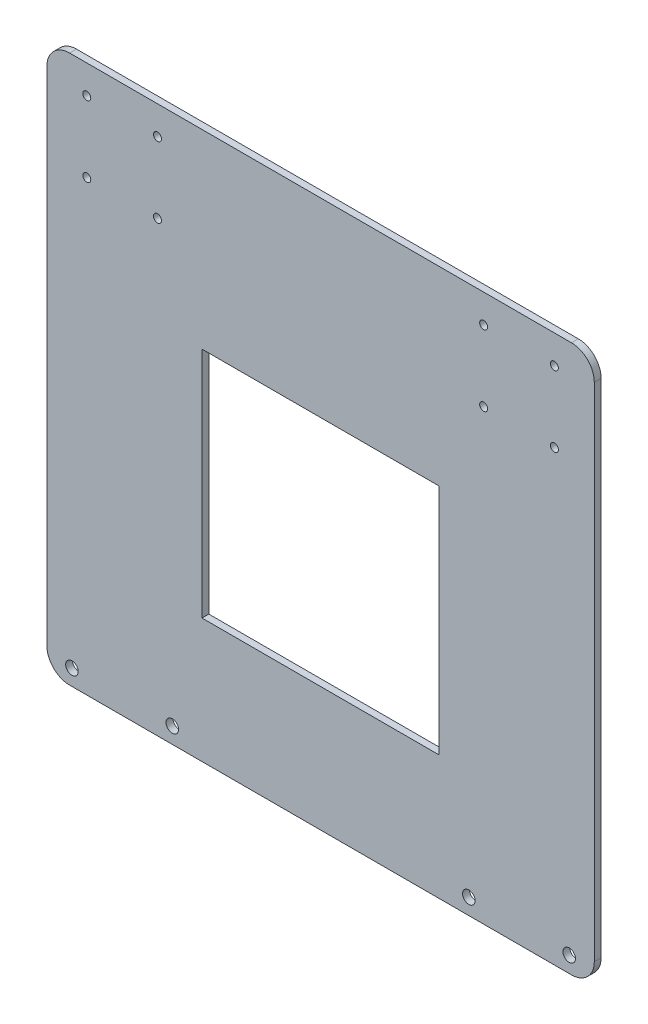
ISO-10303-21;
HEADER;
FILE_DESCRIPTION(('STEP AP214'),'2;1');
FILE_NAME('part.step','',(''),(''),'','','');
FILE_SCHEMA(('AUTOMOTIVE_DESIGN { 1 0 10303 214 1 1 1 1 }'));
ENDSEC;
DATA;
#1=APPLICATION_CONTEXT('core data for automotive mechanical design processes');
#2=APPLICATION_PROTOCOL_DEFINITION('international standard','automotive_design',2000,#1);
#3=PRODUCT_CONTEXT('',#1,'mechanical');
#4=PRODUCT('Part','Part','',(#3));
#5=PRODUCT_RELATED_PRODUCT_CATEGORY('part','',(#4));
#6=PRODUCT_DEFINITION_FORMATION('','',#4);
#7=PRODUCT_DEFINITION_CONTEXT('part definition',#1,'design');
#8=PRODUCT_DEFINITION('design','',#6,#7);
#9=PRODUCT_DEFINITION_SHAPE('','',#8);
#10=(LENGTH_UNIT() NAMED_UNIT(*) SI_UNIT(.MILLI.,.METRE.));
#11=(NAMED_UNIT(*) PLANE_ANGLE_UNIT() SI_UNIT($,.RADIAN.));
#12=(NAMED_UNIT(*) SI_UNIT($,.STERADIAN.) SOLID_ANGLE_UNIT());
#13=UNCERTAINTY_MEASURE_WITH_UNIT(LENGTH_MEASURE(1.E-05),#10,'distance_accuracy_value','');
#14=(GEOMETRIC_REPRESENTATION_CONTEXT(3) GLOBAL_UNCERTAINTY_ASSIGNED_CONTEXT((#13)) GLOBAL_UNIT_ASSIGNED_CONTEXT((#10,
#11,#12)) REPRESENTATION_CONTEXT('',''));
#15=CARTESIAN_POINT('',(0.,0.,0.));
#16=DIRECTION('',(0.,0.,1.));
#17=DIRECTION('',(1.,0.,0.));
#18=AXIS2_PLACEMENT_3D('',#15,#16,#17);
#19=CARTESIAN_POINT('',(108.968983292191,-110.515508353905,3.));
#20=DIRECTION('',(0.,0.,1.));
#21=DIRECTION('',(1.,0.,0.));
#22=AXIS2_PLACEMENT_3D('',#19,#20,#21);
#23=PLANE('',#22);
#24=DIRECTION('',(0.,1.,0.));
#25=VECTOR('',#24,1.);
#26=CARTESIAN_POINT('',(50.9689832921907,-66.0155083539046,3.));
#27=LINE('',#26,#25);
#28=CARTESIAN_POINT('',(50.9689832921907,-66.0155083539046,3.));
#29=VERTEX_POINT('',#28);
#30=CARTESIAN_POINT('',(50.9689832921907,36.0844916460954,3.));
#31=VERTEX_POINT('',#30);
#32=EDGE_CURVE('E61',#29,#31,#27,.T.);
#33=ORIENTED_EDGE('',*,*,#32,.F.);
#34=DIRECTION('',(1.,0.,0.));
#35=VECTOR('',#34,1.);
#36=CARTESIAN_POINT('',(-53.0310167078093,-66.0155083539046,3.));
#37=LINE('',#36,#35);
#38=CARTESIAN_POINT('',(-53.0310167078093,-66.0155083539046,3.));
#39=VERTEX_POINT('',#38);
#40=EDGE_CURVE('E156',#39,#29,#37,.T.);
#41=ORIENTED_EDGE('',*,*,#40,.F.);
#42=DIRECTION('',(0.,-1.,0.));
#43=VECTOR('',#42,1.);
#44=CARTESIAN_POINT('',(-53.0310167078093,-66.0155083539046,3.));
#45=LINE('',#44,#43);
#46=CARTESIAN_POINT('',(-53.0310167078093,36.0844916460954,3.));
#47=VERTEX_POINT('',#46);
#48=EDGE_CURVE('E162',#47,#39,#45,.T.);
#49=ORIENTED_EDGE('',*,*,#48,.F.);
#50=DIRECTION('',(-1.,0.,0.));
#51=VECTOR('',#50,1.);
#52=CARTESIAN_POINT('',(-53.0310167078093,36.0844916460954,3.));
#53=LINE('',#52,#51);
#54=EDGE_CURVE('E171',#31,#47,#53,.T.);
#55=ORIENTED_EDGE('',*,*,#54,.F.);
#56=EDGE_LOOP('',(#33,#41,#49,#55));
#57=FACE_BOUND('',#56,.T.);
#58=CARTESIAN_POINT('',(70.4689832921908,75.9844916460954,3.));
#59=DIRECTION('',(0.,0.,1.));
#60=DIRECTION('',(1.,0.,0.));
#61=AXIS2_PLACEMENT_3D('',#58,#59,#60);
#62=CIRCLE('',#61,1.75);
#63=CARTESIAN_POINT('',(72.2189832921908,75.9844916460954,3.));
#64=VERTEX_POINT('',#63);
#65=EDGE_CURVE('E194',#64,#64,#62,.T.);
#66=ORIENTED_EDGE('',*,*,#65,.F.);
#67=EDGE_LOOP('',(#66));
#68=FACE_BOUND('',#67,.T.);
#69=CARTESIAN_POINT('',(101.468983292191,106.984491646095,3.));
#70=DIRECTION('',(0.,0.,1.));
#71=DIRECTION('',(1.,0.,0.));
#72=AXIS2_PLACEMENT_3D('',#69,#70,#71);
#73=CIRCLE('',#72,1.75);
#74=CARTESIAN_POINT('',(103.218983292191,106.984491646095,3.));
#75=VERTEX_POINT('',#74);
#76=EDGE_CURVE('E210',#75,#75,#73,.T.);
#77=ORIENTED_EDGE('',*,*,#76,.F.);
#78=EDGE_LOOP('',(#77));
#79=FACE_BOUND('',#78,.T.);
#80=CARTESIAN_POINT('',(63.9689832921907,-113.515508353905,3.));
#81=DIRECTION('',(0.,0.,1.));
#82=DIRECTION('',(1.,0.,0.));
#83=AXIS2_PLACEMENT_3D('',#80,#81,#82);
#84=CIRCLE('',#83,2.75000000000001);
#85=CARTESIAN_POINT('',(66.7189832921907,-113.515508353905,3.));
#86=VERTEX_POINT('',#85);
#87=EDGE_CURVE('E226',#86,#86,#84,.T.);
#88=ORIENTED_EDGE('',*,*,#87,.F.);
#89=EDGE_LOOP('',(#88));
#90=FACE_BOUND('',#89,.T.);
#91=CARTESIAN_POINT('',(-110.031016707809,-113.515508353905,3.));
#92=DIRECTION('',(0.,0.,1.));
#93=DIRECTION('',(1.,0.,0.));
#94=AXIS2_PLACEMENT_3D('',#91,#92,#93);
#95=CIRCLE('',#94,2.75000000000001);
#96=CARTESIAN_POINT('',(-107.281016707809,-113.515508353905,3.));
#97=VERTEX_POINT('',#96);
#98=EDGE_CURVE('E242',#97,#97,#95,.T.);
#99=ORIENTED_EDGE('',*,*,#98,.F.);
#100=EDGE_LOOP('',(#99));
#101=FACE_BOUND('',#100,.T.);
#102=CARTESIAN_POINT('',(-72.5310167078093,106.984491646095,3.));
#103=DIRECTION('',(0.,0.,1.));
#104=DIRECTION('',(1.,0.,0.));
#105=AXIS2_PLACEMENT_3D('',#102,#103,#104);
#106=CIRCLE('',#105,1.75);
#107=CARTESIAN_POINT('',(-70.7810167078093,106.984491646095,3.));
#108=VERTEX_POINT('',#107);
#109=EDGE_CURVE('E258',#108,#108,#106,.T.);
#110=ORIENTED_EDGE('',*,*,#109,.F.);
#111=EDGE_LOOP('',(#110));
#112=FACE_BOUND('',#111,.T.);
#113=CARTESIAN_POINT('',(-103.531016707809,75.9844916460954,3.));
#114=DIRECTION('',(0.,0.,1.));
#115=DIRECTION('',(1.,0.,0.));
#116=AXIS2_PLACEMENT_3D('',#113,#114,#115);
#117=CIRCLE('',#116,1.75);
#118=CARTESIAN_POINT('',(-101.781016707809,75.9844916460954,3.));
#119=VERTEX_POINT('',#118);
#120=EDGE_CURVE('E274',#119,#119,#117,.T.);
#121=ORIENTED_EDGE('',*,*,#120,.F.);
#122=EDGE_LOOP('',(#121));
#123=FACE_BOUND('',#122,.T.);
#124=CARTESIAN_POINT('',(108.968983292191,-110.515508353905,3.));
#125=DIRECTION('',(0.,0.,1.));
#126=DIRECTION('',(1.,0.,0.));
#127=AXIS2_PLACEMENT_3D('',#124,#125,#126);
#128=CIRCLE('',#127,9.99999999999999);
#129=CARTESIAN_POINT('',(108.968983292191,-120.515508353905,3.));
#130=VERTEX_POINT('',#129);
#131=CARTESIAN_POINT('',(118.968983292191,-110.515508353905,3.));
#132=VERTEX_POINT('',#131);
#133=EDGE_CURVE('E282',#130,#132,#128,.T.);
#134=ORIENTED_EDGE('',*,*,#133,.T.);
#135=DIRECTION('',(0.,1.,0.));
#136=VECTOR('',#135,1.);
#137=CARTESIAN_POINT('',(118.968983292191,-110.515508353905,3.));
#138=LINE('',#137,#136);
#139=CARTESIAN_POINT('',(118.968983292191,109.484491646095,3.));
#140=VERTEX_POINT('',#139);
#141=EDGE_CURVE('E286',#132,#140,#138,.T.);
#142=ORIENTED_EDGE('',*,*,#141,.T.);
#143=CARTESIAN_POINT('',(108.968983292191,109.484491646095,3.));
#144=DIRECTION('',(0.,0.,1.));
#145=DIRECTION('',(1.,0.,0.));
#146=AXIS2_PLACEMENT_3D('',#143,#144,#145);
#147=CIRCLE('',#146,10.);
#148=CARTESIAN_POINT('',(108.968983292191,119.484491646095,3.));
#149=VERTEX_POINT('',#148);
#150=EDGE_CURVE('E290',#140,#149,#147,.T.);
#151=ORIENTED_EDGE('',*,*,#150,.T.);
#152=DIRECTION('',(-1.,0.,0.));
#153=VECTOR('',#152,1.);
#154=CARTESIAN_POINT('',(108.968983292191,119.484491646095,3.));
#155=LINE('',#154,#153);
#156=CARTESIAN_POINT('',(-111.031016707809,119.484491646095,3.));
#157=VERTEX_POINT('',#156);
#158=EDGE_CURVE('E293',#149,#157,#155,.T.);
#159=ORIENTED_EDGE('',*,*,#158,.T.);
#160=CARTESIAN_POINT('',(-111.031016707809,109.484491646095,3.));
#161=DIRECTION('',(0.,0.,1.));
#162=DIRECTION('',(1.,0.,0.));
#163=AXIS2_PLACEMENT_3D('',#160,#161,#162);
#164=CIRCLE('',#163,10.);
#165=CARTESIAN_POINT('',(-121.031016707809,109.484491646095,3.));
#166=VERTEX_POINT('',#165);
#167=EDGE_CURVE('E296',#157,#166,#164,.T.);
#168=ORIENTED_EDGE('',*,*,#167,.T.);
#169=DIRECTION('',(0.,-1.,0.));
#170=VECTOR('',#169,1.);
#171=CARTESIAN_POINT('',(-121.031016707809,109.484491646095,3.));
#172=LINE('',#171,#170);
#173=CARTESIAN_POINT('',(-121.031016707809,-110.515508353905,3.));
#174=VERTEX_POINT('',#173);
#175=EDGE_CURVE('E299',#166,#174,#172,.T.);
#176=ORIENTED_EDGE('',*,*,#175,.T.);
#177=CARTESIAN_POINT('',(-111.031016707809,-110.515508353905,3.));
#178=DIRECTION('',(0.,0.,1.));
#179=DIRECTION('',(1.,0.,0.));
#180=AXIS2_PLACEMENT_3D('',#177,#178,#179);
#181=CIRCLE('',#180,9.99999999999999);
#182=CARTESIAN_POINT('',(-111.031016707809,-120.515508353905,3.));
#183=VERTEX_POINT('',#182);
#184=EDGE_CURVE('E302',#174,#183,#181,.T.);
#185=ORIENTED_EDGE('',*,*,#184,.T.);
#186=DIRECTION('',(1.,0.,0.));
#187=VECTOR('',#186,1.);
#188=CARTESIAN_POINT('',(-111.031016707809,-120.515508353905,3.));
#189=LINE('',#188,#187);
#190=EDGE_CURVE('E305',#183,#130,#189,.T.);
#191=ORIENTED_EDGE('',*,*,#190,.T.);
#192=EDGE_LOOP('',(#134,#142,#151,#159,#168,#176,#185,#191));
#193=FACE_BOUND('',#192,.T.);
#194=CARTESIAN_POINT('',(-103.531016707809,106.984491646095,3.));
#195=DIRECTION('',(0.,0.,1.));
#196=DIRECTION('',(1.,0.,0.));
#197=AXIS2_PLACEMENT_3D('',#194,#195,#196);
#198=CIRCLE('',#197,1.75);
#199=CARTESIAN_POINT('',(-101.781016707809,106.984491646095,3.));
#200=VERTEX_POINT('',#199);
#201=EDGE_CURVE('E266',#200,#200,#198,.T.);
#202=ORIENTED_EDGE('',*,*,#201,.F.);
#203=EDGE_LOOP('',(#202));
#204=FACE_BOUND('',#203,.T.);
#205=CARTESIAN_POINT('',(-72.5310167078093,75.9844916460954,3.));
#206=DIRECTION('',(0.,0.,1.));
#207=DIRECTION('',(1.,0.,0.));
#208=AXIS2_PLACEMENT_3D('',#205,#206,#207);
#209=CIRCLE('',#208,1.75);
#210=CARTESIAN_POINT('',(-70.7810167078093,75.9844916460954,3.));
#211=VERTEX_POINT('',#210);
#212=EDGE_CURVE('E250',#211,#211,#209,.T.);
#213=ORIENTED_EDGE('',*,*,#212,.F.);
#214=EDGE_LOOP('',(#213));
#215=FACE_BOUND('',#214,.T.);
#216=CARTESIAN_POINT('',(-66.0310167078092,-113.515508353905,3.));
#217=DIRECTION('',(0.,0.,1.));
#218=DIRECTION('',(1.,0.,0.));
#219=AXIS2_PLACEMENT_3D('',#216,#217,#218);
#220=CIRCLE('',#219,2.75000000000001);
#221=CARTESIAN_POINT('',(-63.2810167078092,-113.515508353905,3.));
#222=VERTEX_POINT('',#221);
#223=EDGE_CURVE('E234',#222,#222,#220,.T.);
#224=ORIENTED_EDGE('',*,*,#223,.F.);
#225=EDGE_LOOP('',(#224));
#226=FACE_BOUND('',#225,.T.);
#227=CARTESIAN_POINT('',(101.468983292191,75.9844916460954,3.));
#228=DIRECTION('',(0.,0.,1.));
#229=DIRECTION('',(1.,0.,0.));
#230=AXIS2_PLACEMENT_3D('',#227,#228,#229);
#231=CIRCLE('',#230,1.75);
#232=CARTESIAN_POINT('',(103.218983292191,75.9844916460954,3.));
#233=VERTEX_POINT('',#232);
#234=EDGE_CURVE('E218',#233,#233,#231,.T.);
#235=ORIENTED_EDGE('',*,*,#234,.F.);
#236=EDGE_LOOP('',(#235));
#237=FACE_BOUND('',#236,.T.);
#238=CARTESIAN_POINT('',(70.4689832921908,106.984491646095,3.));
#239=DIRECTION('',(0.,0.,1.));
#240=DIRECTION('',(1.,0.,0.));
#241=AXIS2_PLACEMENT_3D('',#238,#239,#240);
#242=CIRCLE('',#241,1.75);
#243=CARTESIAN_POINT('',(72.2189832921908,106.984491646095,3.));
#244=VERTEX_POINT('',#243);
#245=EDGE_CURVE('E202',#244,#244,#242,.T.);
#246=ORIENTED_EDGE('',*,*,#245,.F.);
#247=EDGE_LOOP('',(#246));
#248=FACE_BOUND('',#247,.T.);
#249=CARTESIAN_POINT('',(107.968983292191,-113.515508353905,3.));
#250=DIRECTION('',(0.,0.,1.));
#251=DIRECTION('',(1.,0.,0.));
#252=AXIS2_PLACEMENT_3D('',#249,#250,#251);
#253=CIRCLE('',#252,2.75000000000001);
#254=CARTESIAN_POINT('',(110.718983292191,-113.515508353905,3.));
#255=VERTEX_POINT('',#254);
#256=EDGE_CURVE('E186',#255,#255,#253,.T.);
#257=ORIENTED_EDGE('',*,*,#256,.F.);
#258=EDGE_LOOP('',(#257));
#259=FACE_BOUND('',#258,.T.);
#260=ADVANCED_FACE('F45',(#57,#68,#79,#90,#101,#112,#123,#193,#204,#215,#226,#237,#248,#259),
#23,.T.);
#261=CARTESIAN_POINT('',(108.968983292191,-110.515508353905,0.));
#262=DIRECTION('',(0.,0.,1.));
#263=DIRECTION('',(1.,0.,0.));
#264=AXIS2_PLACEMENT_3D('',#261,#262,#263);
#265=PLANE('',#264);
#266=DIRECTION('',(1.,0.,0.));
#267=VECTOR('',#266,1.);
#268=CARTESIAN_POINT('',(-53.0310167078093,-66.0155083539046,0.));
#269=LINE('',#268,#267);
#270=CARTESIAN_POINT('',(-53.0310167078093,-66.0155083539046,0.));
#271=VERTEX_POINT('',#270);
#272=CARTESIAN_POINT('',(50.9689832921907,-66.0155083539046,0.));
#273=VERTEX_POINT('',#272);
#274=EDGE_CURVE('E144',#271,#273,#269,.T.);
#275=ORIENTED_EDGE('',*,*,#274,.T.);
#276=DIRECTION('',(0.,1.,0.));
#277=VECTOR('',#276,1.);
#278=CARTESIAN_POINT('',(50.9689832921907,-66.0155083539046,0.));
#279=LINE('',#278,#277);
#280=CARTESIAN_POINT('',(50.9689832921907,36.0844916460954,0.));
#281=VERTEX_POINT('',#280);
#282=EDGE_CURVE('E137',#273,#281,#279,.T.);
#283=ORIENTED_EDGE('',*,*,#282,.T.);
#284=DIRECTION('',(-1.,0.,0.));
#285=VECTOR('',#284,1.);
#286=CARTESIAN_POINT('',(-53.0310167078093,36.0844916460954,0.));
#287=LINE('',#286,#285);
#288=CARTESIAN_POINT('',(-53.0310167078093,36.0844916460954,0.));
#289=VERTEX_POINT('',#288);
#290=EDGE_CURVE('E147',#281,#289,#287,.T.);
#291=ORIENTED_EDGE('',*,*,#290,.T.);
#292=DIRECTION('',(0.,-1.,0.));
#293=VECTOR('',#292,1.);
#294=CARTESIAN_POINT('',(-53.0310167078093,-66.0155083539046,0.));
#295=LINE('',#294,#293);
#296=EDGE_CURVE('E69',#289,#271,#295,.T.);
#297=ORIENTED_EDGE('',*,*,#296,.T.);
#298=EDGE_LOOP('',(#275,#283,#291,#297));
#299=FACE_BOUND('',#298,.T.);
#300=CARTESIAN_POINT('',(108.968983292191,-110.515508353905,0.));
#301=DIRECTION('',(0.,0.,1.));
#302=DIRECTION('',(1.,0.,0.));
#303=AXIS2_PLACEMENT_3D('',#300,#301,#302);
#304=CIRCLE('',#303,9.99999999999999);
#305=CARTESIAN_POINT('',(108.968983292191,-120.515508353905,0.));
#306=VERTEX_POINT('',#305);
#307=CARTESIAN_POINT('',(118.968983292191,-110.515508353905,0.));
#308=VERTEX_POINT('',#307);
#309=EDGE_CURVE('E278',#306,#308,#304,.T.);
#310=ORIENTED_EDGE('',*,*,#309,.F.);
#311=DIRECTION('',(1.,0.,0.));
#312=VECTOR('',#311,1.);
#313=CARTESIAN_POINT('',(-111.031016707809,-120.515508353905,0.));
#314=LINE('',#313,#312);
#315=CARTESIAN_POINT('',(-111.031016707809,-120.515508353905,0.));
#316=VERTEX_POINT('',#315);
#317=EDGE_CURVE('E287',#316,#306,#314,.T.);
#318=ORIENTED_EDGE('',*,*,#317,.F.);
#319=CARTESIAN_POINT('',(-111.031016707809,-110.515508353905,0.));
#320=DIRECTION('',(0.,0.,1.));
#321=DIRECTION('',(1.,0.,0.));
#322=AXIS2_PLACEMENT_3D('',#319,#320,#321);
#323=CIRCLE('',#322,9.99999999999999);
#324=CARTESIAN_POINT('',(-121.031016707809,-110.515508353905,0.));
#325=VERTEX_POINT('',#324);
#326=EDGE_CURVE('E327',#325,#316,#323,.T.);
#327=ORIENTED_EDGE('',*,*,#326,.F.);
#328=DIRECTION('',(0.,-1.,0.));
#329=VECTOR('',#328,1.);
#330=CARTESIAN_POINT('',(-121.031016707809,109.484491646095,0.));
#331=LINE('',#330,#329);
#332=CARTESIAN_POINT('',(-121.031016707809,109.484491646095,0.));
#333=VERTEX_POINT('',#332);
#334=EDGE_CURVE('E324',#333,#325,#331,.T.);
#335=ORIENTED_EDGE('',*,*,#334,.F.);
#336=CARTESIAN_POINT('',(-111.031016707809,109.484491646095,0.));
#337=DIRECTION('',(0.,0.,1.));
#338=DIRECTION('',(1.,0.,0.));
#339=AXIS2_PLACEMENT_3D('',#336,#337,#338);
#340=CIRCLE('',#339,10.);
#341=CARTESIAN_POINT('',(-111.031016707809,119.484491646095,0.));
#342=VERTEX_POINT('',#341);
#343=EDGE_CURVE('E321',#342,#333,#340,.T.);
#344=ORIENTED_EDGE('',*,*,#343,.F.);
#345=DIRECTION('',(-1.,0.,0.));
#346=VECTOR('',#345,1.);
#347=CARTESIAN_POINT('',(108.968983292191,119.484491646095,0.));
#348=LINE('',#347,#346);
#349=CARTESIAN_POINT('',(108.968983292191,119.484491646095,0.));
#350=VERTEX_POINT('',#349);
#351=EDGE_CURVE('E318',#350,#342,#348,.T.);
#352=ORIENTED_EDGE('',*,*,#351,.F.);
#353=CARTESIAN_POINT('',(108.968983292191,109.484491646095,0.));
#354=DIRECTION('',(0.,0.,1.));
#355=DIRECTION('',(1.,0.,0.));
#356=AXIS2_PLACEMENT_3D('',#353,#354,#355);
#357=CIRCLE('',#356,10.);
#358=CARTESIAN_POINT('',(118.968983292191,109.484491646095,0.));
#359=VERTEX_POINT('',#358);
#360=EDGE_CURVE('E315',#359,#350,#357,.T.);
#361=ORIENTED_EDGE('',*,*,#360,.F.);
#362=DIRECTION('',(0.,1.,0.));
#363=VECTOR('',#362,1.);
#364=CARTESIAN_POINT('',(118.968983292191,-110.515508353905,0.));
#365=LINE('',#364,#363);
#366=EDGE_CURVE('E312',#308,#359,#365,.T.);
#367=ORIENTED_EDGE('',*,*,#366,.F.);
#368=EDGE_LOOP('',(#310,#318,#327,#335,#344,#352,#361,#367));
#369=FACE_BOUND('',#368,.T.);
#370=CARTESIAN_POINT('',(-103.531016707809,75.9844916460954,0.));
#371=DIRECTION('',(0.,0.,1.));
#372=DIRECTION('',(1.,0.,0.));
#373=AXIS2_PLACEMENT_3D('',#370,#371,#372);
#374=CIRCLE('',#373,1.75);
#375=CARTESIAN_POINT('',(-101.781016707809,75.9844916460954,0.));
#376=VERTEX_POINT('',#375);
#377=EDGE_CURVE('E270',#376,#376,#374,.T.);
#378=ORIENTED_EDGE('',*,*,#377,.T.);
#379=EDGE_LOOP('',(#378));
#380=FACE_BOUND('',#379,.T.);
#381=CARTESIAN_POINT('',(-103.531016707809,106.984491646095,0.));
#382=DIRECTION('',(0.,0.,1.));
#383=DIRECTION('',(1.,0.,0.));
#384=AXIS2_PLACEMENT_3D('',#381,#382,#383);
#385=CIRCLE('',#384,1.75);
#386=CARTESIAN_POINT('',(-101.781016707809,106.984491646095,0.));
#387=VERTEX_POINT('',#386);
#388=EDGE_CURVE('E262',#387,#387,#385,.T.);
#389=ORIENTED_EDGE('',*,*,#388,.T.);
#390=EDGE_LOOP('',(#389));
#391=FACE_BOUND('',#390,.T.);
#392=CARTESIAN_POINT('',(-72.5310167078093,106.984491646095,0.));
#393=DIRECTION('',(0.,0.,1.));
#394=DIRECTION('',(1.,0.,0.));
#395=AXIS2_PLACEMENT_3D('',#392,#393,#394);
#396=CIRCLE('',#395,1.75);
#397=CARTESIAN_POINT('',(-70.7810167078093,106.984491646095,0.));
#398=VERTEX_POINT('',#397);
#399=EDGE_CURVE('E254',#398,#398,#396,.T.);
#400=ORIENTED_EDGE('',*,*,#399,.T.);
#401=EDGE_LOOP('',(#400));
#402=FACE_BOUND('',#401,.T.);
#403=CARTESIAN_POINT('',(-72.5310167078093,75.9844916460954,0.));
#404=DIRECTION('',(0.,0.,1.));
#405=DIRECTION('',(1.,0.,0.));
#406=AXIS2_PLACEMENT_3D('',#403,#404,#405);
#407=CIRCLE('',#406,1.75);
#408=CARTESIAN_POINT('',(-70.7810167078093,75.9844916460954,0.));
#409=VERTEX_POINT('',#408);
#410=EDGE_CURVE('E246',#409,#409,#407,.T.);
#411=ORIENTED_EDGE('',*,*,#410,.T.);
#412=EDGE_LOOP('',(#411));
#413=FACE_BOUND('',#412,.T.);
#414=CARTESIAN_POINT('',(-110.031016707809,-113.515508353905,0.));
#415=DIRECTION('',(0.,0.,1.));
#416=DIRECTION('',(1.,0.,0.));
#417=AXIS2_PLACEMENT_3D('',#414,#415,#416);
#418=CIRCLE('',#417,2.75000000000001);
#419=CARTESIAN_POINT('',(-107.281016707809,-113.515508353905,0.));
#420=VERTEX_POINT('',#419);
#421=EDGE_CURVE('E238',#420,#420,#418,.T.);
#422=ORIENTED_EDGE('',*,*,#421,.T.);
#423=EDGE_LOOP('',(#422));
#424=FACE_BOUND('',#423,.T.);
#425=CARTESIAN_POINT('',(-66.0310167078092,-113.515508353905,0.));
#426=DIRECTION('',(0.,0.,1.));
#427=DIRECTION('',(1.,0.,0.));
#428=AXIS2_PLACEMENT_3D('',#425,#426,#427);
#429=CIRCLE('',#428,2.75000000000001);
#430=CARTESIAN_POINT('',(-63.2810167078092,-113.515508353905,0.));
#431=VERTEX_POINT('',#430);
#432=EDGE_CURVE('E230',#431,#431,#429,.T.);
#433=ORIENTED_EDGE('',*,*,#432,.T.);
#434=EDGE_LOOP('',(#433));
#435=FACE_BOUND('',#434,.T.);
#436=CARTESIAN_POINT('',(63.9689832921907,-113.515508353905,0.));
#437=DIRECTION('',(0.,0.,1.));
#438=DIRECTION('',(1.,0.,0.));
#439=AXIS2_PLACEMENT_3D('',#436,#437,#438);
#440=CIRCLE('',#439,2.75000000000001);
#441=CARTESIAN_POINT('',(66.7189832921907,-113.515508353905,0.));
#442=VERTEX_POINT('',#441);
#443=EDGE_CURVE('E222',#442,#442,#440,.T.);
#444=ORIENTED_EDGE('',*,*,#443,.T.);
#445=EDGE_LOOP('',(#444));
#446=FACE_BOUND('',#445,.T.);
#447=CARTESIAN_POINT('',(101.468983292191,75.9844916460954,0.));
#448=DIRECTION('',(0.,0.,1.));
#449=DIRECTION('',(1.,0.,0.));
#450=AXIS2_PLACEMENT_3D('',#447,#448,#449);
#451=CIRCLE('',#450,1.75);
#452=CARTESIAN_POINT('',(103.218983292191,75.9844916460954,0.));
#453=VERTEX_POINT('',#452);
#454=EDGE_CURVE('E214',#453,#453,#451,.T.);
#455=ORIENTED_EDGE('',*,*,#454,.T.);
#456=EDGE_LOOP('',(#455));
#457=FACE_BOUND('',#456,.T.);
#458=CARTESIAN_POINT('',(101.468983292191,106.984491646095,0.));
#459=DIRECTION('',(0.,0.,1.));
#460=DIRECTION('',(1.,0.,0.));
#461=AXIS2_PLACEMENT_3D('',#458,#459,#460);
#462=CIRCLE('',#461,1.75);
#463=CARTESIAN_POINT('',(103.218983292191,106.984491646095,0.));
#464=VERTEX_POINT('',#463);
#465=EDGE_CURVE('E206',#464,#464,#462,.T.);
#466=ORIENTED_EDGE('',*,*,#465,.T.);
#467=EDGE_LOOP('',(#466));
#468=FACE_BOUND('',#467,.T.);
#469=CARTESIAN_POINT('',(70.4689832921908,106.984491646095,0.));
#470=DIRECTION('',(0.,0.,1.));
#471=DIRECTION('',(1.,0.,0.));
#472=AXIS2_PLACEMENT_3D('',#469,#470,#471);
#473=CIRCLE('',#472,1.75);
#474=CARTESIAN_POINT('',(72.2189832921908,106.984491646095,0.));
#475=VERTEX_POINT('',#474);
#476=EDGE_CURVE('E198',#475,#475,#473,.T.);
#477=ORIENTED_EDGE('',*,*,#476,.T.);
#478=EDGE_LOOP('',(#477));
#479=FACE_BOUND('',#478,.T.);
#480=CARTESIAN_POINT('',(70.4689832921908,75.9844916460954,0.));
#481=DIRECTION('',(0.,0.,1.));
#482=DIRECTION('',(1.,0.,0.));
#483=AXIS2_PLACEMENT_3D('',#480,#481,#482);
#484=CIRCLE('',#483,1.75);
#485=CARTESIAN_POINT('',(72.2189832921908,75.9844916460954,0.));
#486=VERTEX_POINT('',#485);
#487=EDGE_CURVE('E190',#486,#486,#484,.T.);
#488=ORIENTED_EDGE('',*,*,#487,.T.);
#489=EDGE_LOOP('',(#488));
#490=FACE_BOUND('',#489,.T.);
#491=CARTESIAN_POINT('',(107.968983292191,-113.515508353905,0.));
#492=DIRECTION('',(0.,0.,1.));
#493=DIRECTION('',(1.,0.,0.));
#494=AXIS2_PLACEMENT_3D('',#491,#492,#493);
#495=CIRCLE('',#494,2.75000000000001);
#496=CARTESIAN_POINT('',(110.718983292191,-113.515508353905,0.));
#497=VERTEX_POINT('',#496);
#498=EDGE_CURVE('E180',#497,#497,#495,.T.);
#499=ORIENTED_EDGE('',*,*,#498,.T.);
#500=EDGE_LOOP('',(#499));
#501=FACE_BOUND('',#500,.T.);
#502=ADVANCED_FACE('F152',(#299,#369,#380,#391,#402,#413,#424,#435,#446,#457,#468,#479,#490,
#501),#265,.F.);
#503=CARTESIAN_POINT('',(108.968983292191,-110.515508353905,3.));
#504=DIRECTION('',(0.,0.,-1.));
#505=DIRECTION('',(-1.,0.,0.));
#506=AXIS2_PLACEMENT_3D('',#503,#504,#505);
#507=CYLINDRICAL_SURFACE('',#506,9.99999999999999);
#508=ORIENTED_EDGE('',*,*,#309,.T.);
#509=DIRECTION('',(0.,0.,-1.));
#510=VECTOR('',#509,1.);
#511=CARTESIAN_POINT('',(118.968983292191,-110.515508353905,3.));
#512=LINE('',#511,#510);
#513=EDGE_CURVE('E11',#132,#308,#512,.T.);
#514=ORIENTED_EDGE('',*,*,#513,.F.);
#515=ORIENTED_EDGE('',*,*,#133,.F.);
#516=DIRECTION('',(0.,0.,-1.));
#517=VECTOR('',#516,1.);
#518=CARTESIAN_POINT('',(108.968983292191,-120.515508353905,3.));
#519=LINE('',#518,#517);
#520=EDGE_CURVE('E308',#130,#306,#519,.T.);
#521=ORIENTED_EDGE('',*,*,#520,.T.);
#522=EDGE_LOOP('',(#508,#514,#515,#521));
#523=FACE_BOUND('',#522,.T.);
#524=ADVANCED_FACE('F47',(#523),#507,.T.);
#525=CARTESIAN_POINT('',(118.968983292191,-110.515508353905,3.));
#526=DIRECTION('',(-1.,0.,0.));
#527=DIRECTION('',(0.,0.,1.));
#528=AXIS2_PLACEMENT_3D('',#525,#526,#527);
#529=PLANE('',#528);
#530=ORIENTED_EDGE('',*,*,#366,.T.);
#531=DIRECTION('',(0.,0.,-1.));
#532=VECTOR('',#531,1.);
#533=CARTESIAN_POINT('',(118.968983292191,109.484491646095,3.));
#534=LINE('',#533,#532);
#535=EDGE_CURVE('E54',#140,#359,#534,.T.);
#536=ORIENTED_EDGE('',*,*,#535,.F.);
#537=ORIENTED_EDGE('',*,*,#141,.F.);
#538=ORIENTED_EDGE('',*,*,#513,.T.);
#539=EDGE_LOOP('',(#530,#536,#537,#538));
#540=FACE_BOUND('',#539,.T.);
#541=ADVANCED_FACE('F384',(#540),#529,.F.);
#542=CARTESIAN_POINT('',(108.968983292191,109.484491646095,3.));
#543=DIRECTION('',(0.,0.,-1.));
#544=DIRECTION('',(-1.,0.,0.));
#545=AXIS2_PLACEMENT_3D('',#542,#543,#544);
#546=CYLINDRICAL_SURFACE('',#545,10.);
#547=ORIENTED_EDGE('',*,*,#360,.T.);
#548=DIRECTION('',(0.,0.,-1.));
#549=VECTOR('',#548,1.);
#550=CARTESIAN_POINT('',(108.968983292191,119.484491646095,3.));
#551=LINE('',#550,#549);
#552=EDGE_CURVE('E351',#149,#350,#551,.T.);
#553=ORIENTED_EDGE('',*,*,#552,.F.);
#554=ORIENTED_EDGE('',*,*,#150,.F.);
#555=ORIENTED_EDGE('',*,*,#535,.T.);
#556=EDGE_LOOP('',(#547,#553,#554,#555));
#557=FACE_BOUND('',#556,.T.);
#558=ADVANCED_FACE('F362',(#557),#546,.T.);
#559=CARTESIAN_POINT('',(108.968983292191,119.484491646095,3.));
#560=DIRECTION('',(0.,-1.,0.));
#561=DIRECTION('',(0.,0.,-1.));
#562=AXIS2_PLACEMENT_3D('',#559,#560,#561);
#563=PLANE('',#562);
#564=ORIENTED_EDGE('',*,*,#351,.T.);
#565=DIRECTION('',(0.,0.,-1.));
#566=VECTOR('',#565,1.);
#567=CARTESIAN_POINT('',(-111.031016707809,119.484491646095,3.));
#568=LINE('',#567,#566);
#569=EDGE_CURVE('E347',#157,#342,#568,.T.);
#570=ORIENTED_EDGE('',*,*,#569,.F.);
#571=ORIENTED_EDGE('',*,*,#158,.F.);
#572=ORIENTED_EDGE('',*,*,#552,.T.);
#573=EDGE_LOOP('',(#564,#570,#571,#572));
#574=FACE_BOUND('',#573,.T.);
#575=ADVANCED_FACE('F372',(#574),#563,.F.);
#576=CARTESIAN_POINT('',(-111.031016707809,109.484491646095,3.));
#577=DIRECTION('',(0.,0.,-1.));
#578=DIRECTION('',(-1.,0.,0.));
#579=AXIS2_PLACEMENT_3D('',#576,#577,#578);
#580=CYLINDRICAL_SURFACE('',#579,10.);
#581=ORIENTED_EDGE('',*,*,#343,.T.);
#582=DIRECTION('',(0.,0.,-1.));
#583=VECTOR('',#582,1.);
#584=CARTESIAN_POINT('',(-121.031016707809,109.484491646095,3.));
#585=LINE('',#584,#583);
#586=EDGE_CURVE('E343',#166,#333,#585,.T.);
#587=ORIENTED_EDGE('',*,*,#586,.F.);
#588=ORIENTED_EDGE('',*,*,#167,.F.);
#589=ORIENTED_EDGE('',*,*,#569,.T.);
#590=EDGE_LOOP('',(#581,#587,#588,#589));
#591=FACE_BOUND('',#590,.T.);
#592=ADVANCED_FACE('F376',(#591),#580,.T.);
#593=CARTESIAN_POINT('',(-121.031016707809,109.484491646095,3.));
#594=DIRECTION('',(1.,0.,0.));
#595=DIRECTION('',(0.,0.,-1.));
#596=AXIS2_PLACEMENT_3D('',#593,#594,#595);
#597=PLANE('',#596);
#598=ORIENTED_EDGE('',*,*,#334,.T.);
#599=DIRECTION('',(0.,0.,-1.));
#600=VECTOR('',#599,1.);
#601=CARTESIAN_POINT('',(-121.031016707809,-110.515508353905,3.));
#602=LINE('',#601,#600);
#603=EDGE_CURVE('E339',#174,#325,#602,.T.);
#604=ORIENTED_EDGE('',*,*,#603,.F.);
#605=ORIENTED_EDGE('',*,*,#175,.F.);
#606=ORIENTED_EDGE('',*,*,#586,.T.);
#607=EDGE_LOOP('',(#598,#604,#605,#606));
#608=FACE_BOUND('',#607,.T.);
#609=ADVANCED_FACE('F397',(#608),#597,.F.);
#610=CARTESIAN_POINT('',(-111.031016707809,-110.515508353905,3.));
#611=DIRECTION('',(0.,0.,-1.));
#612=DIRECTION('',(-1.,0.,0.));
#613=AXIS2_PLACEMENT_3D('',#610,#611,#612);
#614=CYLINDRICAL_SURFACE('',#613,9.99999999999999);
#615=ORIENTED_EDGE('',*,*,#326,.T.);
#616=DIRECTION('',(0.,0.,-1.));
#617=VECTOR('',#616,1.);
#618=CARTESIAN_POINT('',(-111.031016707809,-120.515508353905,3.));
#619=LINE('',#618,#617);
#620=EDGE_CURVE('E335',#183,#316,#619,.T.);
#621=ORIENTED_EDGE('',*,*,#620,.F.);
#622=ORIENTED_EDGE('',*,*,#184,.F.);
#623=ORIENTED_EDGE('',*,*,#603,.T.);
#624=EDGE_LOOP('',(#615,#621,#622,#623));
#625=FACE_BOUND('',#624,.T.);
#626=ADVANCED_FACE('F395',(#625),#614,.T.);
#627=CARTESIAN_POINT('',(-111.031016707809,-120.515508353905,3.));
#628=DIRECTION('',(0.,1.,0.));
#629=DIRECTION('',(0.,0.,1.));
#630=AXIS2_PLACEMENT_3D('',#627,#628,#629);
#631=PLANE('',#630);
#632=ORIENTED_EDGE('',*,*,#317,.T.);
#633=ORIENTED_EDGE('',*,*,#520,.F.);
#634=ORIENTED_EDGE('',*,*,#190,.F.);
#635=ORIENTED_EDGE('',*,*,#620,.T.);
#636=EDGE_LOOP('',(#632,#633,#634,#635));
#637=FACE_BOUND('',#636,.T.);
#638=ADVANCED_FACE('F390',(#637),#631,.F.);
#639=CARTESIAN_POINT('',(-103.531016707809,75.9844916460954,3.));
#640=DIRECTION('',(0.,0.,-1.));
#641=DIRECTION('',(-1.,0.,0.));
#642=AXIS2_PLACEMENT_3D('',#639,#640,#641);
#643=CYLINDRICAL_SURFACE('',#642,1.75);
#644=ORIENTED_EDGE('',*,*,#120,.T.);
#645=EDGE_LOOP('',(#644));
#646=FACE_BOUND('',#645,.T.);
#647=ORIENTED_EDGE('',*,*,#377,.F.);
#648=EDGE_LOOP('',(#647));
#649=FACE_BOUND('',#648,.T.);
#650=ADVANCED_FACE('F415',(#646,#649),#643,.F.);
#651=CARTESIAN_POINT('',(-103.531016707809,106.984491646095,3.));
#652=DIRECTION('',(0.,0.,-1.));
#653=DIRECTION('',(-1.,0.,0.));
#654=AXIS2_PLACEMENT_3D('',#651,#652,#653);
#655=CYLINDRICAL_SURFACE('',#654,1.75);
#656=ORIENTED_EDGE('',*,*,#201,.T.);
#657=EDGE_LOOP('',(#656));
#658=FACE_BOUND('',#657,.T.);
#659=ORIENTED_EDGE('',*,*,#388,.F.);
#660=EDGE_LOOP('',(#659));
#661=FACE_BOUND('',#660,.T.);
#662=ADVANCED_FACE('F422',(#658,#661),#655,.F.);
#663=CARTESIAN_POINT('',(-72.5310167078093,106.984491646095,3.));
#664=DIRECTION('',(0.,0.,-1.));
#665=DIRECTION('',(-1.,0.,0.));
#666=AXIS2_PLACEMENT_3D('',#663,#664,#665);
#667=CYLINDRICAL_SURFACE('',#666,1.75);
#668=ORIENTED_EDGE('',*,*,#109,.T.);
#669=EDGE_LOOP('',(#668));
#670=FACE_BOUND('',#669,.T.);
#671=ORIENTED_EDGE('',*,*,#399,.F.);
#672=EDGE_LOOP('',(#671));
#673=FACE_BOUND('',#672,.T.);
#674=ADVANCED_FACE('F427',(#670,#673),#667,.F.);
#675=CARTESIAN_POINT('',(-72.5310167078093,75.9844916460954,3.));
#676=DIRECTION('',(0.,0.,-1.));
#677=DIRECTION('',(-1.,0.,0.));
#678=AXIS2_PLACEMENT_3D('',#675,#676,#677);
#679=CYLINDRICAL_SURFACE('',#678,1.75);
#680=ORIENTED_EDGE('',*,*,#212,.T.);
#681=EDGE_LOOP('',(#680));
#682=FACE_BOUND('',#681,.T.);
#683=ORIENTED_EDGE('',*,*,#410,.F.);
#684=EDGE_LOOP('',(#683));
#685=FACE_BOUND('',#684,.T.);
#686=ADVANCED_FACE('F493',(#682,#685),#679,.F.);
#687=CARTESIAN_POINT('',(-110.031016707809,-113.515508353905,3.));
#688=DIRECTION('',(0.,0.,-1.));
#689=DIRECTION('',(-1.,0.,0.));
#690=AXIS2_PLACEMENT_3D('',#687,#688,#689);
#691=CYLINDRICAL_SURFACE('',#690,2.75000000000001);
#692=ORIENTED_EDGE('',*,*,#98,.T.);
#693=EDGE_LOOP('',(#692));
#694=FACE_BOUND('',#693,.T.);
#695=ORIENTED_EDGE('',*,*,#421,.F.);
#696=EDGE_LOOP('',(#695));
#697=FACE_BOUND('',#696,.T.);
#698=ADVANCED_FACE('F489',(#694,#697),#691,.F.);
#699=CARTESIAN_POINT('',(-66.0310167078092,-113.515508353905,3.));
#700=DIRECTION('',(0.,0.,-1.));
#701=DIRECTION('',(-1.,0.,0.));
#702=AXIS2_PLACEMENT_3D('',#699,#700,#701);
#703=CYLINDRICAL_SURFACE('',#702,2.75000000000001);
#704=ORIENTED_EDGE('',*,*,#223,.T.);
#705=EDGE_LOOP('',(#704));
#706=FACE_BOUND('',#705,.T.);
#707=ORIENTED_EDGE('',*,*,#432,.F.);
#708=EDGE_LOOP('',(#707));
#709=FACE_BOUND('',#708,.T.);
#710=ADVANCED_FACE('F485',(#706,#709),#703,.F.);
#711=CARTESIAN_POINT('',(63.9689832921907,-113.515508353905,3.));
#712=DIRECTION('',(0.,0.,-1.));
#713=DIRECTION('',(-1.,0.,0.));
#714=AXIS2_PLACEMENT_3D('',#711,#712,#713);
#715=CYLINDRICAL_SURFACE('',#714,2.75000000000001);
#716=ORIENTED_EDGE('',*,*,#87,.T.);
#717=EDGE_LOOP('',(#716));
#718=FACE_BOUND('',#717,.T.);
#719=ORIENTED_EDGE('',*,*,#443,.F.);
#720=EDGE_LOOP('',(#719));
#721=FACE_BOUND('',#720,.T.);
#722=ADVANCED_FACE('F481',(#718,#721),#715,.F.);
#723=CARTESIAN_POINT('',(101.468983292191,75.9844916460954,3.));
#724=DIRECTION('',(0.,0.,-1.));
#725=DIRECTION('',(-1.,0.,0.));
#726=AXIS2_PLACEMENT_3D('',#723,#724,#725);
#727=CYLINDRICAL_SURFACE('',#726,1.75);
#728=ORIENTED_EDGE('',*,*,#234,.T.);
#729=EDGE_LOOP('',(#728));
#730=FACE_BOUND('',#729,.T.);
#731=ORIENTED_EDGE('',*,*,#454,.F.);
#732=EDGE_LOOP('',(#731));
#733=FACE_BOUND('',#732,.T.);
#734=ADVANCED_FACE('F477',(#730,#733),#727,.F.);
#735=CARTESIAN_POINT('',(101.468983292191,106.984491646095,3.));
#736=DIRECTION('',(0.,0.,-1.));
#737=DIRECTION('',(-1.,0.,0.));
#738=AXIS2_PLACEMENT_3D('',#735,#736,#737);
#739=CYLINDRICAL_SURFACE('',#738,1.75);
#740=ORIENTED_EDGE('',*,*,#76,.T.);
#741=EDGE_LOOP('',(#740));
#742=FACE_BOUND('',#741,.T.);
#743=ORIENTED_EDGE('',*,*,#465,.F.);
#744=EDGE_LOOP('',(#743));
#745=FACE_BOUND('',#744,.T.);
#746=ADVANCED_FACE('F473',(#742,#745),#739,.F.);
#747=CARTESIAN_POINT('',(70.4689832921908,106.984491646095,3.));
#748=DIRECTION('',(0.,0.,-1.));
#749=DIRECTION('',(-1.,0.,0.));
#750=AXIS2_PLACEMENT_3D('',#747,#748,#749);
#751=CYLINDRICAL_SURFACE('',#750,1.75);
#752=ORIENTED_EDGE('',*,*,#245,.T.);
#753=EDGE_LOOP('',(#752));
#754=FACE_BOUND('',#753,.T.);
#755=ORIENTED_EDGE('',*,*,#476,.F.);
#756=EDGE_LOOP('',(#755));
#757=FACE_BOUND('',#756,.T.);
#758=ADVANCED_FACE('F466',(#754,#757),#751,.F.);
#759=CARTESIAN_POINT('',(70.4689832921908,75.9844916460954,3.));
#760=DIRECTION('',(0.,0.,-1.));
#761=DIRECTION('',(-1.,0.,0.));
#762=AXIS2_PLACEMENT_3D('',#759,#760,#761);
#763=CYLINDRICAL_SURFACE('',#762,1.75);
#764=ORIENTED_EDGE('',*,*,#65,.T.);
#765=EDGE_LOOP('',(#764));
#766=FACE_BOUND('',#765,.T.);
#767=ORIENTED_EDGE('',*,*,#487,.F.);
#768=EDGE_LOOP('',(#767));
#769=FACE_BOUND('',#768,.T.);
#770=ADVANCED_FACE('F457',(#766,#769),#763,.F.);
#771=CARTESIAN_POINT('',(107.968983292191,-113.515508353905,3.));
#772=DIRECTION('',(0.,0.,-1.));
#773=DIRECTION('',(-1.,0.,0.));
#774=AXIS2_PLACEMENT_3D('',#771,#772,#773);
#775=CYLINDRICAL_SURFACE('',#774,2.75000000000001);
#776=ORIENTED_EDGE('',*,*,#256,.T.);
#777=EDGE_LOOP('',(#776));
#778=FACE_BOUND('',#777,.T.);
#779=ORIENTED_EDGE('',*,*,#498,.F.);
#780=EDGE_LOOP('',(#779));
#781=FACE_BOUND('',#780,.T.);
#782=ADVANCED_FACE('F455',(#778,#781),#775,.F.);
#783=CARTESIAN_POINT('',(50.9689832921907,-66.0155083539046,0.));
#784=DIRECTION('',(1.,0.,0.));
#785=DIRECTION('',(0.,0.,-1.));
#786=AXIS2_PLACEMENT_3D('',#783,#784,#785);
#787=PLANE('',#786);
#788=ORIENTED_EDGE('',*,*,#32,.T.);
#789=DIRECTION('',(0.,0.,1.));
#790=VECTOR('',#789,1.);
#791=CARTESIAN_POINT('',(50.9689832921907,36.0844916460954,0.));
#792=LINE('',#791,#790);
#793=EDGE_CURVE('E133',#281,#31,#792,.T.);
#794=ORIENTED_EDGE('',*,*,#793,.F.);
#795=ORIENTED_EDGE('',*,*,#282,.F.);
#796=DIRECTION('',(0.,0.,1.));
#797=VECTOR('',#796,1.);
#798=CARTESIAN_POINT('',(50.9689832921907,-66.0155083539046,0.));
#799=LINE('',#798,#797);
#800=EDGE_CURVE('E177',#273,#29,#799,.T.);
#801=ORIENTED_EDGE('',*,*,#800,.T.);
#802=EDGE_LOOP('',(#788,#794,#795,#801));
#803=FACE_BOUND('',#802,.T.);
#804=ADVANCED_FACE('F135',(#803),#787,.F.);
#805=CARTESIAN_POINT('',(-53.0310167078093,-66.0155083539046,0.));
#806=DIRECTION('',(0.,-1.,0.));
#807=DIRECTION('',(0.,0.,-1.));
#808=AXIS2_PLACEMENT_3D('',#805,#806,#807);
#809=PLANE('',#808);
#810=ORIENTED_EDGE('',*,*,#40,.T.);
#811=ORIENTED_EDGE('',*,*,#800,.F.);
#812=ORIENTED_EDGE('',*,*,#274,.F.);
#813=DIRECTION('',(0.,0.,1.));
#814=VECTOR('',#813,1.);
#815=CARTESIAN_POINT('',(-53.0310167078093,-66.0155083539046,0.));
#816=LINE('',#815,#814);
#817=EDGE_CURVE('E181',#271,#39,#816,.T.);
#818=ORIENTED_EDGE('',*,*,#817,.T.);
#819=EDGE_LOOP('',(#810,#811,#812,#818));
#820=FACE_BOUND('',#819,.T.);
#821=ADVANCED_FACE('F464',(#820),#809,.F.);
#822=CARTESIAN_POINT('',(-53.0310167078093,-66.0155083539046,0.));
#823=DIRECTION('',(-1.,0.,0.));
#824=DIRECTION('',(0.,-1.,0.));
#825=AXIS2_PLACEMENT_3D('',#822,#823,#824);
#826=PLANE('',#825);
#827=ORIENTED_EDGE('',*,*,#48,.T.);
#828=ORIENTED_EDGE('',*,*,#817,.F.);
#829=ORIENTED_EDGE('',*,*,#296,.F.);
#830=DIRECTION('',(0.,0.,1.));
#831=VECTOR('',#830,1.);
#832=CARTESIAN_POINT('',(-53.0310167078093,36.0844916460954,0.));
#833=LINE('',#832,#831);
#834=EDGE_CURVE('E143',#289,#47,#833,.T.);
#835=ORIENTED_EDGE('',*,*,#834,.T.);
#836=EDGE_LOOP('',(#827,#828,#829,#835));
#837=FACE_BOUND('',#836,.T.);
#838=ADVANCED_FACE('F576',(#837),#826,.F.);
#839=CARTESIAN_POINT('',(-53.0310167078093,36.0844916460954,0.));
#840=DIRECTION('',(0.,1.,0.));
#841=DIRECTION('',(0.,0.,1.));
#842=AXIS2_PLACEMENT_3D('',#839,#840,#841);
#843=PLANE('',#842);
#844=ORIENTED_EDGE('',*,*,#54,.T.);
#845=ORIENTED_EDGE('',*,*,#834,.F.);
#846=ORIENTED_EDGE('',*,*,#290,.F.);
#847=ORIENTED_EDGE('',*,*,#793,.T.);
#848=EDGE_LOOP('',(#844,#845,#846,#847));
#849=FACE_BOUND('',#848,.T.);
#850=ADVANCED_FACE('F148',(#849),#843,.F.);
#851=CLOSED_SHELL('',(#260,#502,#524,#541,#558,#575,#592,#609,#626,#638,#650,#662,#674,#686,
#698,#710,#722,#734,#746,#758,#770,#782,#804,#821,#838,#850));
#852=MANIFOLD_SOLID_BREP('B2',#851);
#853=ADVANCED_BREP_SHAPE_REPRESENTATION('',(#18,#852),#14);
#854=SHAPE_DEFINITION_REPRESENTATION(#9,#853);
ENDSEC;
END-ISO-10303-21;
